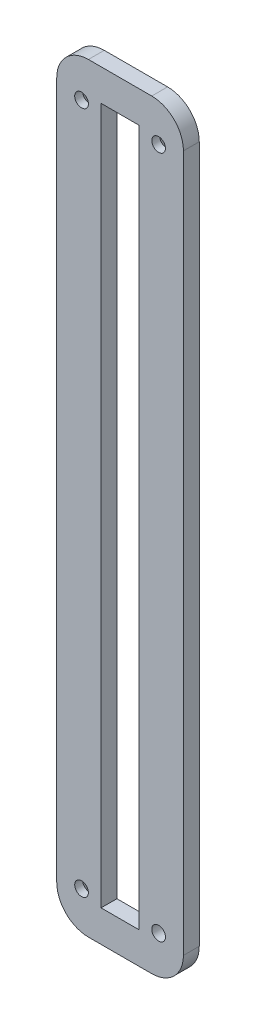
ISO-10303-21;
HEADER;
FILE_DESCRIPTION(('STEP AP214'),'2;1');
FILE_NAME('part.step','',(''),(''),'','','');
FILE_SCHEMA(('AUTOMOTIVE_DESIGN { 1 0 10303 214 1 1 1 1 }'));
ENDSEC;
DATA;
#1=APPLICATION_CONTEXT('core data for automotive mechanical design processes');
#2=APPLICATION_PROTOCOL_DEFINITION('international standard','automotive_design',2000,#1);
#3=PRODUCT_CONTEXT('',#1,'mechanical');
#4=PRODUCT('Part','Part','',(#3));
#5=PRODUCT_RELATED_PRODUCT_CATEGORY('part','',(#4));
#6=PRODUCT_DEFINITION_FORMATION('','',#4);
#7=PRODUCT_DEFINITION_CONTEXT('part definition',#1,'design');
#8=PRODUCT_DEFINITION('design','',#6,#7);
#9=PRODUCT_DEFINITION_SHAPE('','',#8);
#10=(LENGTH_UNIT() NAMED_UNIT(*) SI_UNIT(.MILLI.,.METRE.));
#11=(NAMED_UNIT(*) PLANE_ANGLE_UNIT() SI_UNIT($,.RADIAN.));
#12=(NAMED_UNIT(*) SI_UNIT($,.STERADIAN.) SOLID_ANGLE_UNIT());
#13=UNCERTAINTY_MEASURE_WITH_UNIT(LENGTH_MEASURE(1.E-05),#10,'distance_accuracy_value','');
#14=(GEOMETRIC_REPRESENTATION_CONTEXT(3) GLOBAL_UNCERTAINTY_ASSIGNED_CONTEXT((#13)) GLOBAL_UNIT_ASSIGNED_CONTEXT((#10,
#11,#12)) REPRESENTATION_CONTEXT('',''));
#15=CARTESIAN_POINT('',(0.,0.,0.));
#16=DIRECTION('',(0.,0.,1.));
#17=DIRECTION('',(1.,0.,0.));
#18=AXIS2_PLACEMENT_3D('',#15,#16,#17);
#19=CARTESIAN_POINT('',(-72.6000000000004,-136.95,1.65));
#20=DIRECTION('',(0.,0.,1.));
#21=DIRECTION('',(1.,0.,0.));
#22=AXIS2_PLACEMENT_3D('',#19,#20,#21);
#23=CYLINDRICAL_SURFACE('',#22,2.74999999999998);
#24=CARTESIAN_POINT('',(-72.6000000000004,-136.95,4.8249999999999));
#25=DIRECTION('',(0.,0.,-1.));
#26=DIRECTION('',(-1.,0.,0.));
#27=AXIS2_PLACEMENT_3D('',#24,#25,#26);
#28=CIRCLE('',#27,2.74999999999998);
#29=CARTESIAN_POINT('',(-75.3500000000004,-136.95,4.8249999999999));
#30=VERTEX_POINT('',#29);
#31=EDGE_CURVE('E53',#30,#30,#28,.T.);
#32=ORIENTED_EDGE('',*,*,#31,.T.);
#33=EDGE_LOOP('',(#32));
#34=FACE_BOUND('',#33,.T.);
#35=CARTESIAN_POINT('',(-72.6000000000004,-136.95,8.));
#36=DIRECTION('',(0.,0.,-1.));
#37=DIRECTION('',(-1.,0.,0.));
#38=AXIS2_PLACEMENT_3D('',#35,#36,#37);
#39=CIRCLE('',#38,2.74999999999998);
#40=CARTESIAN_POINT('',(-75.3500000000004,-136.95,8.));
#41=VERTEX_POINT('',#40);
#42=EDGE_CURVE('E227',#41,#41,#39,.F.);
#43=ORIENTED_EDGE('',*,*,#42,.T.);
#44=EDGE_LOOP('',(#43));
#45=FACE_BOUND('',#44,.T.);
#46=ADVANCED_FACE('F43',(#34,#45),#23,.F.);
#47=CARTESIAN_POINT('',(-72.6000000000004,136.95,1.65));
#48=DIRECTION('',(0.,0.,1.));
#49=DIRECTION('',(1.,0.,0.));
#50=AXIS2_PLACEMENT_3D('',#47,#48,#49);
#51=CYLINDRICAL_SURFACE('',#50,2.75000000000001);
#52=CARTESIAN_POINT('',(-72.6000000000004,136.95,4.82499999999996));
#53=DIRECTION('',(0.,0.,-1.));
#54=DIRECTION('',(-1.,0.,0.));
#55=AXIS2_PLACEMENT_3D('',#52,#53,#54);
#56=CIRCLE('',#55,2.75000000000001);
#57=CARTESIAN_POINT('',(-75.3500000000004,136.95,4.82499999999996));
#58=VERTEX_POINT('',#57);
#59=EDGE_CURVE('E11',#58,#58,#56,.T.);
#60=ORIENTED_EDGE('',*,*,#59,.T.);
#61=EDGE_LOOP('',(#60));
#62=FACE_BOUND('',#61,.T.);
#63=CARTESIAN_POINT('',(-72.6000000000004,136.95,8.));
#64=DIRECTION('',(0.,0.,-1.));
#65=DIRECTION('',(-1.,0.,0.));
#66=AXIS2_PLACEMENT_3D('',#63,#64,#65);
#67=CIRCLE('',#66,2.75000000000001);
#68=CARTESIAN_POINT('',(-75.3500000000004,136.95,8.));
#69=VERTEX_POINT('',#68);
#70=EDGE_CURVE('E286',#69,#69,#67,.F.);
#71=ORIENTED_EDGE('',*,*,#70,.T.);
#72=EDGE_LOOP('',(#71));
#73=FACE_BOUND('',#72,.T.);
#74=ADVANCED_FACE('F303',(#62,#73),#51,.F.);
#75=CARTESIAN_POINT('',(-41.6999999999999,136.95,1.65));
#76=DIRECTION('',(0.,0.,1.));
#77=DIRECTION('',(1.,0.,0.));
#78=AXIS2_PLACEMENT_3D('',#75,#76,#77);
#79=CYLINDRICAL_SURFACE('',#78,2.74999999999998);
#80=CARTESIAN_POINT('',(-41.6999999999999,136.95,4.82499999999999));
#81=DIRECTION('',(0.,0.,-1.));
#82=DIRECTION('',(-1.,0.,0.));
#83=AXIS2_PLACEMENT_3D('',#80,#81,#82);
#84=CIRCLE('',#83,2.74999999999998);
#85=CARTESIAN_POINT('',(-44.4499999999999,136.95,4.82499999999999));
#86=VERTEX_POINT('',#85);
#87=EDGE_CURVE('E193',#86,#86,#84,.T.);
#88=ORIENTED_EDGE('',*,*,#87,.T.);
#89=EDGE_LOOP('',(#88));
#90=FACE_BOUND('',#89,.T.);
#91=CARTESIAN_POINT('',(-41.6999999999999,136.95,8.));
#92=DIRECTION('',(0.,0.,-1.));
#93=DIRECTION('',(-1.,0.,0.));
#94=AXIS2_PLACEMENT_3D('',#91,#92,#93);
#95=CIRCLE('',#94,2.74999999999998);
#96=CARTESIAN_POINT('',(-44.4499999999999,136.95,8.));
#97=VERTEX_POINT('',#96);
#98=EDGE_CURVE('E283',#97,#97,#95,.F.);
#99=ORIENTED_EDGE('',*,*,#98,.T.);
#100=EDGE_LOOP('',(#99));
#101=FACE_BOUND('',#100,.T.);
#102=ADVANCED_FACE('F307',(#90,#101),#79,.F.);
#103=CARTESIAN_POINT('',(-41.6999999999999,-136.95,1.65));
#104=DIRECTION('',(0.,0.,1.));
#105=DIRECTION('',(1.,0.,0.));
#106=AXIS2_PLACEMENT_3D('',#103,#104,#105);
#107=CYLINDRICAL_SURFACE('',#106,2.74999999999998);
#108=CARTESIAN_POINT('',(-41.6999999999999,-136.95,8.));
#109=DIRECTION('',(0.,0.,-1.));
#110=DIRECTION('',(-1.,0.,0.));
#111=AXIS2_PLACEMENT_3D('',#108,#109,#110);
#112=CIRCLE('',#111,2.74999999999998);
#113=CARTESIAN_POINT('',(-44.4499999999998,-136.95,8.));
#114=VERTEX_POINT('',#113);
#115=EDGE_CURVE('E280',#114,#114,#112,.F.);
#116=ORIENTED_EDGE('',*,*,#115,.T.);
#117=EDGE_LOOP('',(#116));
#118=FACE_BOUND('',#117,.T.);
#119=CARTESIAN_POINT('',(-41.6999999999999,-136.95,1.65));
#120=DIRECTION('',(0.,0.,-1.));
#121=DIRECTION('',(-1.,0.,0.));
#122=AXIS2_PLACEMENT_3D('',#119,#120,#121);
#123=CIRCLE('',#122,2.74999999999998);
#124=CARTESIAN_POINT('',(-44.4499999999998,-136.95,1.65));
#125=VERTEX_POINT('',#124);
#126=EDGE_CURVE('E172',#125,#125,#123,.F.);
#127=ORIENTED_EDGE('',*,*,#126,.F.);
#128=EDGE_LOOP('',(#127));
#129=FACE_BOUND('',#128,.T.);
#130=ADVANCED_FACE('F313',(#118,#129),#107,.F.);
#131=CARTESIAN_POINT('',(-49.5300000000002,0.,1.65));
#132=DIRECTION('',(-1.,0.,0.));
#133=DIRECTION('',(0.,0.,1.));
#134=AXIS2_PLACEMENT_3D('',#131,#132,#133);
#135=PLANE('',#134);
#136=DIRECTION('',(0.,-1.,0.));
#137=VECTOR('',#136,1.);
#138=CARTESIAN_POINT('',(-49.5300000000002,0.,8.));
#139=LINE('',#138,#137);
#140=CARTESIAN_POINT('',(-49.5300000000002,139.700000000002,8.));
#141=VERTEX_POINT('',#140);
#142=CARTESIAN_POINT('',(-49.5300000000002,-139.7,8.));
#143=VERTEX_POINT('',#142);
#144=EDGE_CURVE('E274',#141,#143,#139,.T.);
#145=ORIENTED_EDGE('',*,*,#144,.F.);
#146=DIRECTION('',(0.,0.,1.));
#147=VECTOR('',#146,1.);
#148=CARTESIAN_POINT('',(-49.5300000000002,139.700000000002,1.65));
#149=LINE('',#148,#147);
#150=CARTESIAN_POINT('',(-49.5300000000002,139.700000000002,1.65));
#151=VERTEX_POINT('',#150);
#152=EDGE_CURVE('E162',#151,#141,#149,.T.);
#153=ORIENTED_EDGE('',*,*,#152,.F.);
#154=DIRECTION('',(0.,-1.,0.));
#155=VECTOR('',#154,1.);
#156=CARTESIAN_POINT('',(-49.5300000000002,0.,1.65));
#157=LINE('',#156,#155);
#158=CARTESIAN_POINT('',(-49.5300000000002,-139.7,1.65));
#159=VERTEX_POINT('',#158);
#160=EDGE_CURVE('E156',#151,#159,#157,.T.);
#161=ORIENTED_EDGE('',*,*,#160,.T.);
#162=DIRECTION('',(0.,0.,1.));
#163=VECTOR('',#162,1.);
#164=CARTESIAN_POINT('',(-49.5300000000002,-139.7,1.65));
#165=LINE('',#164,#163);
#166=EDGE_CURVE('E108',#159,#143,#165,.T.);
#167=ORIENTED_EDGE('',*,*,#166,.T.);
#168=EDGE_LOOP('',(#145,#153,#161,#167));
#169=FACE_BOUND('',#168,.T.);
#170=ADVANCED_FACE('F316',(#169),#135,.T.);
#171=CARTESIAN_POINT('',(0.,139.700000000002,1.65));
#172=DIRECTION('',(0.,1.,0.));
#173=DIRECTION('',(0.,0.,1.));
#174=AXIS2_PLACEMENT_3D('',#171,#172,#173);
#175=PLANE('',#174);
#176=DIRECTION('',(-1.,0.,0.));
#177=VECTOR('',#176,1.);
#178=CARTESIAN_POINT('',(0.,139.700000000002,8.));
#179=LINE('',#178,#177);
#180=CARTESIAN_POINT('',(-64.7700000000002,139.700000000002,8.));
#181=VERTEX_POINT('',#180);
#182=EDGE_CURVE('E161',#141,#181,#179,.T.);
#183=ORIENTED_EDGE('',*,*,#182,.T.);
#184=DIRECTION('',(0.,0.,1.));
#185=VECTOR('',#184,1.);
#186=CARTESIAN_POINT('',(-64.7700000000002,139.700000000002,1.65));
#187=LINE('',#186,#185);
#188=CARTESIAN_POINT('',(-64.7700000000002,139.700000000002,1.65));
#189=VERTEX_POINT('',#188);
#190=EDGE_CURVE('E149',#189,#181,#187,.T.);
#191=ORIENTED_EDGE('',*,*,#190,.F.);
#192=DIRECTION('',(-1.,0.,0.));
#193=VECTOR('',#192,1.);
#194=CARTESIAN_POINT('',(0.,139.700000000002,1.65));
#195=LINE('',#194,#193);
#196=EDGE_CURVE('E152',#151,#189,#195,.T.);
#197=ORIENTED_EDGE('',*,*,#196,.F.);
#198=ORIENTED_EDGE('',*,*,#152,.T.);
#199=EDGE_LOOP('',(#183,#191,#197,#198));
#200=FACE_BOUND('',#199,.T.);
#201=ADVANCED_FACE('F159',(#200),#175,.F.);
#202=CARTESIAN_POINT('',(-64.7700000000002,0.,1.65));
#203=DIRECTION('',(-1.,0.,0.));
#204=DIRECTION('',(0.,0.,1.));
#205=AXIS2_PLACEMENT_3D('',#202,#203,#204);
#206=PLANE('',#205);
#207=DIRECTION('',(0.,-1.,0.));
#208=VECTOR('',#207,1.);
#209=CARTESIAN_POINT('',(-64.7700000000002,0.,8.));
#210=LINE('',#209,#208);
#211=CARTESIAN_POINT('',(-64.7700000000002,-139.7,8.));
#212=VERTEX_POINT('',#211);
#213=EDGE_CURVE('E277',#181,#212,#210,.T.);
#214=ORIENTED_EDGE('',*,*,#213,.T.);
#215=DIRECTION('',(0.,0.,1.));
#216=VECTOR('',#215,1.);
#217=CARTESIAN_POINT('',(-64.7700000000002,-139.7,1.65));
#218=LINE('',#217,#216);
#219=CARTESIAN_POINT('',(-64.7700000000002,-139.7,1.65));
#220=VERTEX_POINT('',#219);
#221=EDGE_CURVE('E151',#220,#212,#218,.T.);
#222=ORIENTED_EDGE('',*,*,#221,.F.);
#223=DIRECTION('',(0.,-1.,0.));
#224=VECTOR('',#223,1.);
#225=CARTESIAN_POINT('',(-64.7700000000002,0.,1.65));
#226=LINE('',#225,#224);
#227=EDGE_CURVE('E144',#189,#220,#226,.T.);
#228=ORIENTED_EDGE('',*,*,#227,.F.);
#229=ORIENTED_EDGE('',*,*,#190,.T.);
#230=EDGE_LOOP('',(#214,#222,#228,#229));
#231=FACE_BOUND('',#230,.T.);
#232=ADVANCED_FACE('F147',(#231),#206,.F.);
#233=CARTESIAN_POINT('',(-44.4499999999998,139.7,1.65));
#234=DIRECTION('',(0.,0.,1.));
#235=DIRECTION('',(1.,0.,0.));
#236=AXIS2_PLACEMENT_3D('',#233,#234,#235);
#237=CYLINDRICAL_SURFACE('',#236,12.6999999999998);
#238=CARTESIAN_POINT('',(-44.4499999999998,139.7,8.));
#239=DIRECTION('',(0.,0.,-1.));
#240=DIRECTION('',(-1.,0.,0.));
#241=AXIS2_PLACEMENT_3D('',#238,#239,#240);
#242=CIRCLE('',#241,12.6999999999998);
#243=CARTESIAN_POINT('',(-31.7500000000003,139.700000000002,8.));
#244=VERTEX_POINT('',#243);
#245=CARTESIAN_POINT('',(-44.4499999999998,152.400000000001,8.));
#246=VERTEX_POINT('',#245);
#247=EDGE_CURVE('E250',#244,#246,#242,.F.);
#248=ORIENTED_EDGE('',*,*,#247,.F.);
#249=DIRECTION('',(0.,0.,1.));
#250=VECTOR('',#249,1.);
#251=CARTESIAN_POINT('',(-31.7500000000003,139.700000000002,1.65));
#252=LINE('',#251,#250);
#253=CARTESIAN_POINT('',(-31.7500000000003,139.700000000002,1.65));
#254=VERTEX_POINT('',#253);
#255=EDGE_CURVE('E115',#254,#244,#252,.T.);
#256=ORIENTED_EDGE('',*,*,#255,.F.);
#257=CARTESIAN_POINT('',(-44.4499999999998,139.7,1.65));
#258=DIRECTION('',(0.,0.,-1.));
#259=DIRECTION('',(-1.,0.,0.));
#260=AXIS2_PLACEMENT_3D('',#257,#258,#259);
#261=CIRCLE('',#260,12.6999999999998);
#262=CARTESIAN_POINT('',(-44.4499999999998,152.400000000001,1.65));
#263=VERTEX_POINT('',#262);
#264=EDGE_CURVE('E218',#254,#263,#261,.F.);
#265=ORIENTED_EDGE('',*,*,#264,.T.);
#266=DIRECTION('',(0.,0.,1.));
#267=VECTOR('',#266,1.);
#268=CARTESIAN_POINT('',(-44.4499999999998,152.400000000001,1.65));
#269=LINE('',#268,#267);
#270=EDGE_CURVE('E169',#263,#246,#269,.T.);
#271=ORIENTED_EDGE('',*,*,#270,.T.);
#272=EDGE_LOOP('',(#248,#256,#265,#271));
#273=FACE_BOUND('',#272,.T.);
#274=ADVANCED_FACE('F325',(#273),#237,.T.);
#275=CARTESIAN_POINT('',(-31.75,0.,1.65));
#276=DIRECTION('',(1.,0.,0.));
#277=DIRECTION('',(0.,0.,-1.));
#278=AXIS2_PLACEMENT_3D('',#275,#276,#277);
#279=PLANE('',#278);
#280=DIRECTION('',(0.,1.,0.));
#281=VECTOR('',#280,1.);
#282=CARTESIAN_POINT('',(-31.75,0.,8.));
#283=LINE('',#282,#281);
#284=CARTESIAN_POINT('',(-31.7500000000003,-139.7,8.));
#285=VERTEX_POINT('',#284);
#286=EDGE_CURVE('E253',#285,#244,#283,.T.);
#287=ORIENTED_EDGE('',*,*,#286,.F.);
#288=DIRECTION('',(0.,0.,1.));
#289=VECTOR('',#288,1.);
#290=CARTESIAN_POINT('',(-31.7500000000003,-139.7,1.65));
#291=LINE('',#290,#289);
#292=CARTESIAN_POINT('',(-31.7500000000003,-139.7,1.65));
#293=VERTEX_POINT('',#292);
#294=EDGE_CURVE('E182',#293,#285,#291,.T.);
#295=ORIENTED_EDGE('',*,*,#294,.F.);
#296=DIRECTION('',(0.,1.,0.));
#297=VECTOR('',#296,1.);
#298=CARTESIAN_POINT('',(-31.75,0.,1.65));
#299=LINE('',#298,#297);
#300=EDGE_CURVE('E221',#293,#254,#299,.T.);
#301=ORIENTED_EDGE('',*,*,#300,.T.);
#302=ORIENTED_EDGE('',*,*,#255,.T.);
#303=EDGE_LOOP('',(#287,#295,#301,#302));
#304=FACE_BOUND('',#303,.T.);
#305=ADVANCED_FACE('F231',(#304),#279,.T.);
#306=CARTESIAN_POINT('',(-44.4500000000002,-139.7,1.65));
#307=DIRECTION('',(0.,0.,1.));
#308=DIRECTION('',(1.,0.,0.));
#309=AXIS2_PLACEMENT_3D('',#306,#307,#308);
#310=CYLINDRICAL_SURFACE('',#309,12.7000000000001);
#311=CARTESIAN_POINT('',(-44.4500000000002,-139.7,8.));
#312=DIRECTION('',(0.,0.,-1.));
#313=DIRECTION('',(-1.,0.,0.));
#314=AXIS2_PLACEMENT_3D('',#311,#312,#313);
#315=CIRCLE('',#314,12.7000000000001);
#316=CARTESIAN_POINT('',(-44.4500000000002,-152.4,8.));
#317=VERTEX_POINT('',#316);
#318=EDGE_CURVE('E256',#317,#285,#315,.F.);
#319=ORIENTED_EDGE('',*,*,#318,.F.);
#320=DIRECTION('',(0.,0.,1.));
#321=VECTOR('',#320,1.);
#322=CARTESIAN_POINT('',(-44.4500000000002,-152.4,1.65));
#323=LINE('',#322,#321);
#324=CARTESIAN_POINT('',(-44.4500000000002,-152.4,1.65));
#325=VERTEX_POINT('',#324);
#326=EDGE_CURVE('E180',#325,#317,#323,.T.);
#327=ORIENTED_EDGE('',*,*,#326,.F.);
#328=CARTESIAN_POINT('',(-44.4500000000002,-139.7,1.65));
#329=DIRECTION('',(0.,0.,-1.));
#330=DIRECTION('',(-1.,0.,0.));
#331=AXIS2_PLACEMENT_3D('',#328,#329,#330);
#332=CIRCLE('',#331,12.7000000000001);
#333=EDGE_CURVE('E232',#325,#293,#332,.F.);
#334=ORIENTED_EDGE('',*,*,#333,.T.);
#335=ORIENTED_EDGE('',*,*,#294,.T.);
#336=EDGE_LOOP('',(#319,#327,#334,#335));
#337=FACE_BOUND('',#336,.T.);
#338=ADVANCED_FACE('F347',(#337),#310,.T.);
#339=CARTESIAN_POINT('',(0.,-152.4,1.65));
#340=DIRECTION('',(0.,1.,0.));
#341=DIRECTION('',(0.,0.,1.));
#342=AXIS2_PLACEMENT_3D('',#339,#340,#341);
#343=PLANE('',#342);
#344=DIRECTION('',(-1.,0.,0.));
#345=VECTOR('',#344,1.);
#346=CARTESIAN_POINT('',(0.,-152.4,8.));
#347=LINE('',#346,#345);
#348=CARTESIAN_POINT('',(-69.8500000000004,-152.4,8.));
#349=VERTEX_POINT('',#348);
#350=EDGE_CURVE('E259',#317,#349,#347,.T.);
#351=ORIENTED_EDGE('',*,*,#350,.T.);
#352=DIRECTION('',(0.,0.,1.));
#353=VECTOR('',#352,1.);
#354=CARTESIAN_POINT('',(-69.8500000000004,-152.4,1.65));
#355=LINE('',#354,#353);
#356=CARTESIAN_POINT('',(-69.8500000000004,-152.4,1.65));
#357=VERTEX_POINT('',#356);
#358=EDGE_CURVE('E178',#357,#349,#355,.T.);
#359=ORIENTED_EDGE('',*,*,#358,.F.);
#360=DIRECTION('',(-1.,0.,0.));
#361=VECTOR('',#360,1.);
#362=CARTESIAN_POINT('',(0.,-152.4,1.65));
#363=LINE('',#362,#361);
#364=EDGE_CURVE('E234',#325,#357,#363,.T.);
#365=ORIENTED_EDGE('',*,*,#364,.F.);
#366=ORIENTED_EDGE('',*,*,#326,.T.);
#367=EDGE_LOOP('',(#351,#359,#365,#366));
#368=FACE_BOUND('',#367,.T.);
#369=ADVANCED_FACE('F343',(#368),#343,.F.);
#370=CARTESIAN_POINT('',(-69.8500000000004,-139.7,1.65));
#371=DIRECTION('',(0.,0.,1.));
#372=DIRECTION('',(1.,0.,0.));
#373=AXIS2_PLACEMENT_3D('',#370,#371,#372);
#374=CYLINDRICAL_SURFACE('',#373,12.7000000000001);
#375=CARTESIAN_POINT('',(-69.8500000000004,-139.7,8.));
#376=DIRECTION('',(0.,0.,-1.));
#377=DIRECTION('',(-1.,0.,0.));
#378=AXIS2_PLACEMENT_3D('',#375,#376,#377);
#379=CIRCLE('',#378,12.7000000000001);
#380=CARTESIAN_POINT('',(-82.5500000000005,-139.7,8.));
#381=VERTEX_POINT('',#380);
#382=EDGE_CURVE('E262',#381,#349,#379,.F.);
#383=ORIENTED_EDGE('',*,*,#382,.F.);
#384=DIRECTION('',(0.,0.,1.));
#385=VECTOR('',#384,1.);
#386=CARTESIAN_POINT('',(-82.5500000000005,-139.7,1.65));
#387=LINE('',#386,#385);
#388=CARTESIAN_POINT('',(-82.5500000000005,-139.7,1.65));
#389=VERTEX_POINT('',#388);
#390=EDGE_CURVE('E176',#389,#381,#387,.T.);
#391=ORIENTED_EDGE('',*,*,#390,.F.);
#392=CARTESIAN_POINT('',(-69.8500000000004,-139.7,1.65));
#393=DIRECTION('',(0.,0.,-1.));
#394=DIRECTION('',(-1.,0.,0.));
#395=AXIS2_PLACEMENT_3D('',#392,#393,#394);
#396=CIRCLE('',#395,12.7000000000001);
#397=EDGE_CURVE('E238',#389,#357,#396,.F.);
#398=ORIENTED_EDGE('',*,*,#397,.T.);
#399=ORIENTED_EDGE('',*,*,#358,.T.);
#400=EDGE_LOOP('',(#383,#391,#398,#399));
#401=FACE_BOUND('',#400,.T.);
#402=ADVANCED_FACE('F339',(#401),#374,.T.);
#403=CARTESIAN_POINT('',(-82.5500000000005,0.,1.65));
#404=DIRECTION('',(1.,0.,0.));
#405=DIRECTION('',(0.,0.,-1.));
#406=AXIS2_PLACEMENT_3D('',#403,#404,#405);
#407=PLANE('',#406);
#408=DIRECTION('',(0.,1.,0.));
#409=VECTOR('',#408,1.);
#410=CARTESIAN_POINT('',(-82.5500000000005,0.,8.));
#411=LINE('',#410,#409);
#412=CARTESIAN_POINT('',(-82.5500000000005,139.700000000002,8.));
#413=VERTEX_POINT('',#412);
#414=EDGE_CURVE('E265',#381,#413,#411,.T.);
#415=ORIENTED_EDGE('',*,*,#414,.T.);
#416=DIRECTION('',(0.,0.,1.));
#417=VECTOR('',#416,1.);
#418=CARTESIAN_POINT('',(-82.5500000000005,139.700000000002,1.65));
#419=LINE('',#418,#417);
#420=CARTESIAN_POINT('',(-82.5500000000005,139.700000000002,1.65));
#421=VERTEX_POINT('',#420);
#422=EDGE_CURVE('E174',#421,#413,#419,.T.);
#423=ORIENTED_EDGE('',*,*,#422,.F.);
#424=DIRECTION('',(0.,1.,0.));
#425=VECTOR('',#424,1.);
#426=CARTESIAN_POINT('',(-82.5500000000005,0.,1.65));
#427=LINE('',#426,#425);
#428=EDGE_CURVE('E241',#389,#421,#427,.T.);
#429=ORIENTED_EDGE('',*,*,#428,.F.);
#430=ORIENTED_EDGE('',*,*,#390,.T.);
#431=EDGE_LOOP('',(#415,#423,#429,#430));
#432=FACE_BOUND('',#431,.T.);
#433=ADVANCED_FACE('F335',(#432),#407,.F.);
#434=CARTESIAN_POINT('',(-69.8500000000001,139.7,1.65));
#435=DIRECTION('',(0.,0.,1.));
#436=DIRECTION('',(1.,0.,0.));
#437=AXIS2_PLACEMENT_3D('',#434,#435,#436);
#438=CYLINDRICAL_SURFACE('',#437,12.7000000000004);
#439=CARTESIAN_POINT('',(-69.8500000000001,139.7,8.));
#440=DIRECTION('',(0.,0.,-1.));
#441=DIRECTION('',(-1.,0.,0.));
#442=AXIS2_PLACEMENT_3D('',#439,#440,#441);
#443=CIRCLE('',#442,12.7000000000004);
#444=CARTESIAN_POINT('',(-69.8500000000001,152.400000000001,8.));
#445=VERTEX_POINT('',#444);
#446=EDGE_CURVE('E268',#445,#413,#443,.F.);
#447=ORIENTED_EDGE('',*,*,#446,.F.);
#448=DIRECTION('',(0.,0.,1.));
#449=VECTOR('',#448,1.);
#450=CARTESIAN_POINT('',(-69.8500000000001,152.400000000001,1.65));
#451=LINE('',#450,#449);
#452=CARTESIAN_POINT('',(-69.8500000000001,152.400000000001,1.65));
#453=VERTEX_POINT('',#452);
#454=EDGE_CURVE('E171',#453,#445,#451,.T.);
#455=ORIENTED_EDGE('',*,*,#454,.F.);
#456=CARTESIAN_POINT('',(-69.8500000000001,139.7,1.65));
#457=DIRECTION('',(0.,0.,-1.));
#458=DIRECTION('',(-1.,0.,0.));
#459=AXIS2_PLACEMENT_3D('',#456,#457,#458);
#460=CIRCLE('',#459,12.7000000000004);
#461=EDGE_CURVE('E243',#453,#421,#460,.F.);
#462=ORIENTED_EDGE('',*,*,#461,.T.);
#463=ORIENTED_EDGE('',*,*,#422,.T.);
#464=EDGE_LOOP('',(#447,#455,#462,#463));
#465=FACE_BOUND('',#464,.T.);
#466=ADVANCED_FACE('F321',(#465),#438,.T.);
#467=CARTESIAN_POINT('',(0.,-139.7,1.65));
#468=DIRECTION('',(0.,-1.,0.));
#469=DIRECTION('',(1.,0.,0.));
#470=AXIS2_PLACEMENT_3D('',#467,#468,#469);
#471=PLANE('',#470);
#472=DIRECTION('',(1.,0.,0.));
#473=VECTOR('',#472,1.);
#474=CARTESIAN_POINT('',(0.,-139.7,8.));
#475=LINE('',#474,#473);
#476=EDGE_CURVE('E101',#212,#143,#475,.T.);
#477=ORIENTED_EDGE('',*,*,#476,.T.);
#478=ORIENTED_EDGE('',*,*,#166,.F.);
#479=DIRECTION('',(1.,0.,0.));
#480=VECTOR('',#479,1.);
#481=CARTESIAN_POINT('',(0.,-139.7,1.65));
#482=LINE('',#481,#480);
#483=EDGE_CURVE('E61',#220,#159,#482,.T.);
#484=ORIENTED_EDGE('',*,*,#483,.F.);
#485=ORIENTED_EDGE('',*,*,#221,.T.);
#486=EDGE_LOOP('',(#477,#478,#484,#485));
#487=FACE_BOUND('',#486,.T.);
#488=ADVANCED_FACE('F318',(#487),#471,.F.);
#489=CARTESIAN_POINT('',(0.,152.400000000002,1.65));
#490=DIRECTION('',(0.,-1.,0.));
#491=DIRECTION('',(0.,0.,-1.));
#492=AXIS2_PLACEMENT_3D('',#489,#490,#491);
#493=PLANE('',#492);
#494=DIRECTION('',(1.,0.,0.));
#495=VECTOR('',#494,1.);
#496=CARTESIAN_POINT('',(0.,152.400000000002,8.));
#497=LINE('',#496,#495);
#498=EDGE_CURVE('E271',#445,#246,#497,.T.);
#499=ORIENTED_EDGE('',*,*,#498,.T.);
#500=ORIENTED_EDGE('',*,*,#270,.F.);
#501=DIRECTION('',(1.,0.,0.));
#502=VECTOR('',#501,1.);
#503=CARTESIAN_POINT('',(0.,152.400000000002,1.65));
#504=LINE('',#503,#502);
#505=EDGE_CURVE('E225',#453,#263,#504,.T.);
#506=ORIENTED_EDGE('',*,*,#505,.F.);
#507=ORIENTED_EDGE('',*,*,#454,.T.);
#508=EDGE_LOOP('',(#499,#500,#506,#507));
#509=FACE_BOUND('',#508,.T.);
#510=ADVANCED_FACE('F209',(#509),#493,.F.);
#511=CARTESIAN_POINT('',(0.,0.,1.65));
#512=DIRECTION('',(0.,0.,-1.));
#513=DIRECTION('',(-1.,0.,0.));
#514=AXIS2_PLACEMENT_3D('',#511,#512,#513);
#515=PLANE('',#514);
#516=CARTESIAN_POINT('',(-41.6999999999999,136.95,1.65));
#517=DIRECTION('',(0.,0.,-1.));
#518=DIRECTION('',(-1.,0.,0.));
#519=AXIS2_PLACEMENT_3D('',#516,#517,#518);
#520=CIRCLE('',#519,5.92499999999996);
#521=CARTESIAN_POINT('',(-47.6249999999998,136.95,1.65));
#522=VERTEX_POINT('',#521);
#523=EDGE_CURVE('E190',#522,#522,#520,.F.);
#524=ORIENTED_EDGE('',*,*,#523,.T.);
#525=EDGE_LOOP('',(#524));
#526=FACE_BOUND('',#525,.T.);
#527=CARTESIAN_POINT('',(-72.6000000000004,-136.95,1.65));
#528=DIRECTION('',(0.,0.,-1.));
#529=DIRECTION('',(-1.,0.,0.));
#530=AXIS2_PLACEMENT_3D('',#527,#528,#529);
#531=CIRCLE('',#530,5.92499999999987);
#532=CARTESIAN_POINT('',(-78.5250000000003,-136.95,1.65));
#533=VERTEX_POINT('',#532);
#534=EDGE_CURVE('E187',#533,#533,#531,.F.);
#535=ORIENTED_EDGE('',*,*,#534,.T.);
#536=EDGE_LOOP('',(#535));
#537=FACE_BOUND('',#536,.T.);
#538=CARTESIAN_POINT('',(-72.6000000000004,136.95,1.65));
#539=DIRECTION('',(0.,0.,-1.));
#540=DIRECTION('',(-1.,0.,0.));
#541=AXIS2_PLACEMENT_3D('',#538,#539,#540);
#542=CIRCLE('',#541,5.92499999999993);
#543=CARTESIAN_POINT('',(-78.5250000000003,136.95,1.65));
#544=VERTEX_POINT('',#543);
#545=EDGE_CURVE('E164',#544,#544,#542,.F.);
#546=ORIENTED_EDGE('',*,*,#545,.T.);
#547=EDGE_LOOP('',(#546));
#548=FACE_BOUND('',#547,.T.);
#549=ORIENTED_EDGE('',*,*,#126,.T.);
#550=EDGE_LOOP('',(#549));
#551=FACE_BOUND('',#550,.T.);
#552=ORIENTED_EDGE('',*,*,#264,.F.);
#553=ORIENTED_EDGE('',*,*,#300,.F.);
#554=ORIENTED_EDGE('',*,*,#333,.F.);
#555=ORIENTED_EDGE('',*,*,#364,.T.);
#556=ORIENTED_EDGE('',*,*,#397,.F.);
#557=ORIENTED_EDGE('',*,*,#428,.T.);
#558=ORIENTED_EDGE('',*,*,#461,.F.);
#559=ORIENTED_EDGE('',*,*,#505,.T.);
#560=EDGE_LOOP('',(#552,#553,#554,#555,#556,#557,#558,#559));
#561=FACE_BOUND('',#560,.T.);
#562=ORIENTED_EDGE('',*,*,#160,.F.);
#563=ORIENTED_EDGE('',*,*,#196,.T.);
#564=ORIENTED_EDGE('',*,*,#227,.T.);
#565=ORIENTED_EDGE('',*,*,#483,.T.);
#566=EDGE_LOOP('',(#562,#563,#564,#565));
#567=FACE_BOUND('',#566,.T.);
#568=ADVANCED_FACE('F155',(#526,#537,#548,#551,#561,#567),#515,.T.);
#569=CARTESIAN_POINT('',(0.,0.,8.));
#570=DIRECTION('',(0.,0.,-1.));
#571=DIRECTION('',(-1.,0.,0.));
#572=AXIS2_PLACEMENT_3D('',#569,#570,#571);
#573=PLANE('',#572);
#574=ORIENTED_EDGE('',*,*,#247,.T.);
#575=ORIENTED_EDGE('',*,*,#498,.F.);
#576=ORIENTED_EDGE('',*,*,#446,.T.);
#577=ORIENTED_EDGE('',*,*,#414,.F.);
#578=ORIENTED_EDGE('',*,*,#382,.T.);
#579=ORIENTED_EDGE('',*,*,#350,.F.);
#580=ORIENTED_EDGE('',*,*,#318,.T.);
#581=ORIENTED_EDGE('',*,*,#286,.T.);
#582=EDGE_LOOP('',(#574,#575,#576,#577,#578,#579,#580,#581));
#583=FACE_BOUND('',#582,.T.);
#584=ORIENTED_EDGE('',*,*,#144,.T.);
#585=ORIENTED_EDGE('',*,*,#476,.F.);
#586=ORIENTED_EDGE('',*,*,#213,.F.);
#587=ORIENTED_EDGE('',*,*,#182,.F.);
#588=EDGE_LOOP('',(#584,#585,#586,#587));
#589=FACE_BOUND('',#588,.T.);
#590=ORIENTED_EDGE('',*,*,#115,.F.);
#591=EDGE_LOOP('',(#590));
#592=FACE_BOUND('',#591,.T.);
#593=ORIENTED_EDGE('',*,*,#98,.F.);
#594=EDGE_LOOP('',(#593));
#595=FACE_BOUND('',#594,.T.);
#596=ORIENTED_EDGE('',*,*,#70,.F.);
#597=EDGE_LOOP('',(#596));
#598=FACE_BOUND('',#597,.T.);
#599=ORIENTED_EDGE('',*,*,#42,.F.);
#600=EDGE_LOOP('',(#599));
#601=FACE_BOUND('',#600,.T.);
#602=ADVANCED_FACE('F208',(#583,#589,#592,#595,#598,#601),#573,.F.);
#603=CARTESIAN_POINT('',(-41.6999999999999,136.95,1.65));
#604=DIRECTION('',(0.,0.,-1.));
#605=DIRECTION('',(-1.,0.,0.));
#606=AXIS2_PLACEMENT_3D('',#603,#604,#605);
#607=CONICAL_SURFACE('',#606,5.92499999999996,0.785398163397446);
#608=ORIENTED_EDGE('',*,*,#87,.F.);
#609=EDGE_LOOP('',(#608));
#610=FACE_BOUND('',#609,.T.);
#611=ORIENTED_EDGE('',*,*,#523,.F.);
#612=EDGE_LOOP('',(#611));
#613=FACE_BOUND('',#612,.T.);
#614=ADVANCED_FACE('F203',(#610,#613),#607,.F.);
#615=CARTESIAN_POINT('',(-72.6000000000004,-136.95,1.65));
#616=DIRECTION('',(0.,0.,-1.));
#617=DIRECTION('',(-1.,0.,0.));
#618=AXIS2_PLACEMENT_3D('',#615,#616,#617);
#619=CONICAL_SURFACE('',#618,5.92499999999987,0.785398163397446);
#620=ORIENTED_EDGE('',*,*,#31,.F.);
#621=EDGE_LOOP('',(#620));
#622=FACE_BOUND('',#621,.T.);
#623=ORIENTED_EDGE('',*,*,#534,.F.);
#624=EDGE_LOOP('',(#623));
#625=FACE_BOUND('',#624,.T.);
#626=ADVANCED_FACE('F200',(#622,#625),#619,.F.);
#627=CARTESIAN_POINT('',(-72.6000000000004,136.95,1.65));
#628=DIRECTION('',(0.,0.,-1.));
#629=DIRECTION('',(-1.,0.,0.));
#630=AXIS2_PLACEMENT_3D('',#627,#628,#629);
#631=CONICAL_SURFACE('',#630,5.92499999999993,0.785398163397442);
#632=ORIENTED_EDGE('',*,*,#59,.F.);
#633=EDGE_LOOP('',(#632));
#634=FACE_BOUND('',#633,.T.);
#635=ORIENTED_EDGE('',*,*,#545,.F.);
#636=EDGE_LOOP('',(#635));
#637=FACE_BOUND('',#636,.T.);
#638=ADVANCED_FACE('F46',(#634,#637),#631,.F.);
#639=CLOSED_SHELL('',(#46,#74,#102,#130,#170,#201,#232,#274,#305,#338,#369,#402,#433,#466,#488,
#510,#568,#602,#614,#626,#638));
#640=MANIFOLD_SOLID_BREP('B2',#639);
#641=ADVANCED_BREP_SHAPE_REPRESENTATION('',(#18,#640),#14);
#642=SHAPE_DEFINITION_REPRESENTATION(#9,#641);
ENDSEC;
END-ISO-10303-21;
